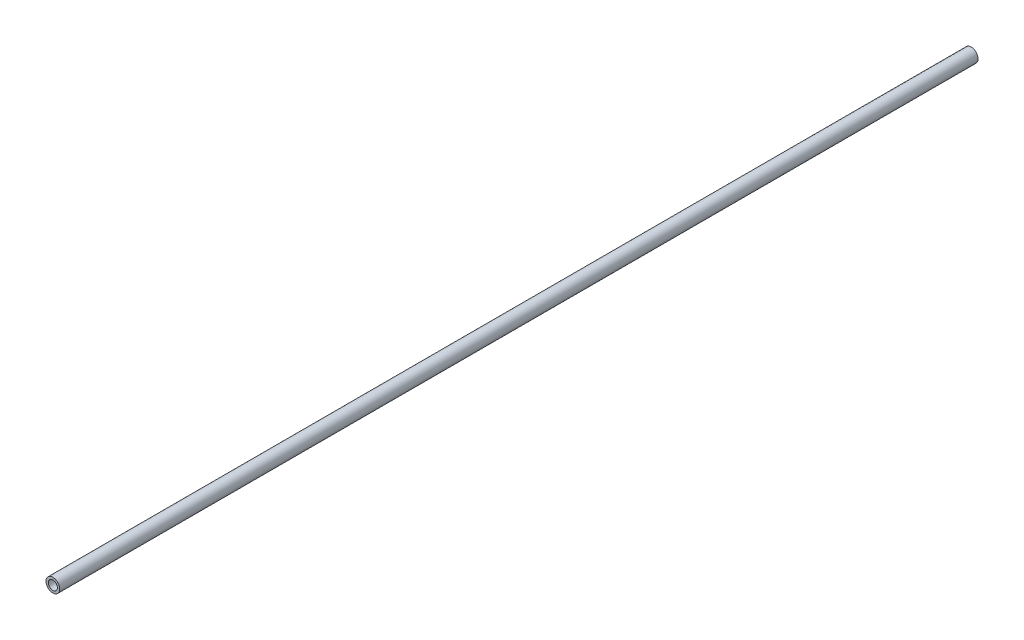
ISO-10303-21;
HEADER;
FILE_DESCRIPTION(('STEP AP214'),'2;1');
FILE_NAME('part.step','',(''),(''),'','','');
FILE_SCHEMA(('AUTOMOTIVE_DESIGN { 1 0 10303 214 1 1 1 1 }'));
ENDSEC;
DATA;
#1=APPLICATION_CONTEXT('core data for automotive mechanical design processes');
#2=APPLICATION_PROTOCOL_DEFINITION('international standard','automotive_design',2000,#1);
#3=PRODUCT_CONTEXT('',#1,'mechanical');
#4=PRODUCT('Part','Part','',(#3));
#5=PRODUCT_RELATED_PRODUCT_CATEGORY('part','',(#4));
#6=PRODUCT_DEFINITION_FORMATION('','',#4);
#7=PRODUCT_DEFINITION_CONTEXT('part definition',#1,'design');
#8=PRODUCT_DEFINITION('design','',#6,#7);
#9=PRODUCT_DEFINITION_SHAPE('','',#8);
#10=(LENGTH_UNIT() NAMED_UNIT(*) SI_UNIT(.MILLI.,.METRE.));
#11=(NAMED_UNIT(*) PLANE_ANGLE_UNIT() SI_UNIT($,.RADIAN.));
#12=(NAMED_UNIT(*) SI_UNIT($,.STERADIAN.) SOLID_ANGLE_UNIT());
#13=UNCERTAINTY_MEASURE_WITH_UNIT(LENGTH_MEASURE(1.E-05),#10,'distance_accuracy_value','');
#14=(GEOMETRIC_REPRESENTATION_CONTEXT(3) GLOBAL_UNCERTAINTY_ASSIGNED_CONTEXT((#13)) GLOBAL_UNIT_ASSIGNED_CONTEXT((#10,
#11,#12)) REPRESENTATION_CONTEXT('',''));
#15=CARTESIAN_POINT('',(0.,0.,0.));
#16=DIRECTION('',(0.,0.,1.));
#17=DIRECTION('',(1.,0.,0.));
#18=AXIS2_PLACEMENT_3D('',#15,#16,#17);
#19=CARTESIAN_POINT('',(0.,0.,1282.7));
#20=DIRECTION('',(0.,0.,1.));
#21=DIRECTION('',(1.,0.,0.));
#22=AXIS2_PLACEMENT_3D('',#19,#20,#21);
#23=PLANE('',#22);
#24=CARTESIAN_POINT('',(0.,0.,1282.7));
#25=DIRECTION('',(0.,0.,1.));
#26=DIRECTION('',(1.,0.,0.));
#27=AXIS2_PLACEMENT_3D('',#24,#25,#26);
#28=CIRCLE('',#27,9.525);
#29=CARTESIAN_POINT('',(-9.525,0.,1282.7));
#30=VERTEX_POINT('',#29);
#31=EDGE_CURVE('E10',#30,#30,#28,.T.);
#32=ORIENTED_EDGE('',*,*,#31,.T.);
#33=EDGE_LOOP('',(#32));
#34=FACE_BOUND('',#33,.T.);
#35=CARTESIAN_POINT('',(0.,0.,1282.7));
#36=DIRECTION('',(0.,0.,1.));
#37=DIRECTION('',(1.,0.,0.));
#38=AXIS2_PLACEMENT_3D('',#35,#36,#37);
#39=CIRCLE('',#38,6.35);
#40=CARTESIAN_POINT('',(-6.35,0.,1282.7));
#41=VERTEX_POINT('',#40);
#42=EDGE_CURVE('E48',#41,#41,#39,.T.);
#43=ORIENTED_EDGE('',*,*,#42,.F.);
#44=EDGE_LOOP('',(#43));
#45=FACE_BOUND('',#44,.T.);
#46=ADVANCED_FACE('F37',(#34,#45),#23,.T.);
#47=CARTESIAN_POINT('',(0.,0.,0.));
#48=DIRECTION('',(0.,0.,1.));
#49=DIRECTION('',(1.,0.,0.));
#50=AXIS2_PLACEMENT_3D('',#47,#48,#49);
#51=PLANE('',#50);
#52=CARTESIAN_POINT('',(0.,0.,0.));
#53=DIRECTION('',(0.,0.,1.));
#54=DIRECTION('',(1.,0.,0.));
#55=AXIS2_PLACEMENT_3D('',#52,#53,#54);
#56=CIRCLE('',#55,9.525);
#57=CARTESIAN_POINT('',(-9.525,0.,0.));
#58=VERTEX_POINT('',#57);
#59=EDGE_CURVE('E41',#58,#58,#56,.T.);
#60=ORIENTED_EDGE('',*,*,#59,.F.);
#61=EDGE_LOOP('',(#60));
#62=FACE_BOUND('',#61,.T.);
#63=CARTESIAN_POINT('',(0.,0.,0.));
#64=DIRECTION('',(0.,0.,1.));
#65=DIRECTION('',(1.,0.,0.));
#66=AXIS2_PLACEMENT_3D('',#63,#64,#65);
#67=CIRCLE('',#66,6.35);
#68=CARTESIAN_POINT('',(-6.35,0.,0.));
#69=VERTEX_POINT('',#68);
#70=EDGE_CURVE('E50',#69,#69,#67,.T.);
#71=ORIENTED_EDGE('',*,*,#70,.T.);
#72=EDGE_LOOP('',(#71));
#73=FACE_BOUND('',#72,.T.);
#74=ADVANCED_FACE('F60',(#62,#73),#51,.F.);
#75=CARTESIAN_POINT('',(0.,0.,1282.7));
#76=DIRECTION('',(0.,0.,-1.));
#77=DIRECTION('',(-1.,0.,0.));
#78=AXIS2_PLACEMENT_3D('',#75,#76,#77);
#79=CYLINDRICAL_SURFACE('',#78,9.525);
#80=CARTESIAN_POINT('',(-9.525,0.,1282.7));
#81=CARTESIAN_POINT('',(-9.525,0.,1269.33854166667));
#82=CARTESIAN_POINT('',(-9.525,0.,1255.97708333333));
#83=CARTESIAN_POINT('',(-9.525,0.,1229.25416666667));
#84=CARTESIAN_POINT('',(-9.525,0.,1215.89270833333));
#85=CARTESIAN_POINT('',(-9.525,0.,1189.16979166667));
#86=CARTESIAN_POINT('',(-9.525,0.,1175.80833333333));
#87=CARTESIAN_POINT('',(-9.525,0.,1149.08541666667));
#88=CARTESIAN_POINT('',(-9.525,0.,1135.72395833333));
#89=CARTESIAN_POINT('',(-9.525,0.,1109.00104166667));
#90=CARTESIAN_POINT('',(-9.525,0.,1095.63958333333));
#91=CARTESIAN_POINT('',(-9.525,0.,1068.91666666667));
#92=CARTESIAN_POINT('',(-9.525,0.,1055.55520833333));
#93=CARTESIAN_POINT('',(-9.525,0.,1028.83229166667));
#94=CARTESIAN_POINT('',(-9.525,0.,1015.47083333333));
#95=CARTESIAN_POINT('',(-9.525,0.,988.747916666666));
#96=CARTESIAN_POINT('',(-9.525,0.,975.386458333333));
#97=CARTESIAN_POINT('',(-9.525,0.,948.663541666667));
#98=CARTESIAN_POINT('',(-9.525,0.,935.302083333333));
#99=CARTESIAN_POINT('',(-9.525,0.,908.579166666667));
#100=CARTESIAN_POINT('',(-9.525,0.,895.217708333333));
#101=CARTESIAN_POINT('',(-9.525,0.,868.494791666667));
#102=CARTESIAN_POINT('',(-9.525,0.,855.133333333333));
#103=CARTESIAN_POINT('',(-9.525,0.,828.410416666666));
#104=CARTESIAN_POINT('',(-9.525,0.,815.048958333333));
#105=CARTESIAN_POINT('',(-9.525,0.,788.326041666667));
#106=CARTESIAN_POINT('',(-9.525,0.,774.964583333333));
#107=CARTESIAN_POINT('',(-9.525,0.,748.241666666667));
#108=CARTESIAN_POINT('',(-9.525,0.,734.880208333333));
#109=CARTESIAN_POINT('',(-9.525,0.,708.157291666667));
#110=CARTESIAN_POINT('',(-9.525,0.,694.795833333333));
#111=CARTESIAN_POINT('',(-9.525,0.,668.072916666667));
#112=CARTESIAN_POINT('',(-9.525,0.,654.711458333333));
#113=CARTESIAN_POINT('',(-9.525,0.,627.988541666667));
#114=CARTESIAN_POINT('',(-9.525,0.,614.627083333333));
#115=CARTESIAN_POINT('',(-9.525,0.,587.904166666667));
#116=CARTESIAN_POINT('',(-9.525,0.,574.542708333333));
#117=CARTESIAN_POINT('',(-9.525,0.,547.819791666667));
#118=CARTESIAN_POINT('',(-9.525,0.,534.458333333333));
#119=CARTESIAN_POINT('',(-9.525,0.,507.735416666667));
#120=CARTESIAN_POINT('',(-9.525,0.,494.373958333333));
#121=CARTESIAN_POINT('',(-9.525,0.,467.651041666667));
#122=CARTESIAN_POINT('',(-9.525,0.,454.289583333333));
#123=CARTESIAN_POINT('',(-9.525,0.,427.566666666667));
#124=CARTESIAN_POINT('',(-9.525,0.,414.205208333333));
#125=CARTESIAN_POINT('',(-9.525,0.,387.482291666667));
#126=CARTESIAN_POINT('',(-9.525,0.,374.120833333333));
#127=CARTESIAN_POINT('',(-9.525,0.,347.397916666667));
#128=CARTESIAN_POINT('',(-9.525,0.,334.036458333333));
#129=CARTESIAN_POINT('',(-9.525,0.,307.313541666667));
#130=CARTESIAN_POINT('',(-9.525,0.,293.952083333333));
#131=CARTESIAN_POINT('',(-9.525,0.,267.229166666667));
#132=CARTESIAN_POINT('',(-9.525,0.,253.867708333333));
#133=CARTESIAN_POINT('',(-9.525,0.,227.144791666667));
#134=CARTESIAN_POINT('',(-9.525,0.,213.783333333333));
#135=CARTESIAN_POINT('',(-9.525,0.,187.060416666667));
#136=CARTESIAN_POINT('',(-9.525,0.,173.698958333333));
#137=CARTESIAN_POINT('',(-9.525,0.,146.976041666667));
#138=CARTESIAN_POINT('',(-9.525,0.,133.614583333333));
#139=CARTESIAN_POINT('',(-9.525,0.,106.891666666667));
#140=CARTESIAN_POINT('',(-9.525,0.,93.5302083333333));
#141=CARTESIAN_POINT('',(-9.525,0.,66.8072916666666));
#142=CARTESIAN_POINT('',(-9.525,0.,53.4458333333333));
#143=CARTESIAN_POINT('',(-9.525,0.,26.7229166666666));
#144=CARTESIAN_POINT('',(-9.525,0.,13.3614583333333));
#145=CARTESIAN_POINT('',(-9.525,0.,0.));
#146=B_SPLINE_CURVE_WITH_KNOTS('',3,(#80,#81,#82,#83,#84,#85,#86,#87,#88,#89,#90,#91,#92,#93,
#94,#95,#96,#97,#98,#99,#100,#101,#102,#103,#104,#105,#106,#107,#108,#109,#110,#111,#112,#113,
#114,#115,#116,#117,#118,#119,#120,#121,#122,#123,#124,#125,#126,#127,#128,#129,#130,#131,#132,
#133,#134,#135,#136,#137,#138,#139,#140,#141,#142,#143,#144,#145),.UNSPECIFIED.,.F.,.F.,(4,2,2,
2,2,2,2,2,2,2,2,2,2,2,2,2,2,2,2,2,2,2,2,2,2,2,2,2,2,2,2,2,4),(0.,40.084375,80.1687499999999,
120.253125,160.3375,200.421875,240.50625,280.590625,320.675,360.759375,400.84375,440.928125,
481.0125,521.096875,561.18125,601.265625,641.35,681.434375,721.51875,761.603125,801.6875,
841.771875,881.85625,921.940625,962.025,1002.109375,1042.19375,1082.278125,1122.3625,
1162.446875,1202.53125,1242.615625,1282.7),.UNSPECIFIED.);
#147=EDGE_CURVE('BSEAM39',#30,#58,#146,.T.);
#148=ORIENTED_EDGE('',*,*,#31,.F.);
#149=ORIENTED_EDGE('',*,*,#59,.T.);
#150=ORIENTED_EDGE('',*,*,#147,.T.);
#151=ORIENTED_EDGE('',*,*,#147,.F.);
#152=EDGE_LOOP('',(#148,#150,#149,#151));
#153=FACE_BOUND('',#152,.T.);
#154=ADVANCED_FACE('F39',(#153),#79,.T.);
#155=CARTESIAN_POINT('',(0.,0.,1282.7));
#156=DIRECTION('',(0.,0.,-1.));
#157=DIRECTION('',(-1.,0.,0.));
#158=AXIS2_PLACEMENT_3D('',#155,#156,#157);
#159=CYLINDRICAL_SURFACE('',#158,6.35);
#160=CARTESIAN_POINT('',(-6.35,0.,1282.7));
#161=CARTESIAN_POINT('',(-6.35,0.,1269.33854166667));
#162=CARTESIAN_POINT('',(-6.35,0.,1255.97708333333));
#163=CARTESIAN_POINT('',(-6.35,0.,1229.25416666667));
#164=CARTESIAN_POINT('',(-6.35,0.,1215.89270833333));
#165=CARTESIAN_POINT('',(-6.35,0.,1189.16979166667));
#166=CARTESIAN_POINT('',(-6.35,0.,1175.80833333333));
#167=CARTESIAN_POINT('',(-6.35,0.,1149.08541666667));
#168=CARTESIAN_POINT('',(-6.35,0.,1135.72395833333));
#169=CARTESIAN_POINT('',(-6.35,0.,1109.00104166667));
#170=CARTESIAN_POINT('',(-6.35,0.,1095.63958333333));
#171=CARTESIAN_POINT('',(-6.35,0.,1068.91666666667));
#172=CARTESIAN_POINT('',(-6.35,0.,1055.55520833333));
#173=CARTESIAN_POINT('',(-6.35,0.,1028.83229166667));
#174=CARTESIAN_POINT('',(-6.35,0.,1015.47083333333));
#175=CARTESIAN_POINT('',(-6.35,0.,988.747916666666));
#176=CARTESIAN_POINT('',(-6.35,0.,975.386458333333));
#177=CARTESIAN_POINT('',(-6.35,0.,948.663541666667));
#178=CARTESIAN_POINT('',(-6.35,0.,935.302083333333));
#179=CARTESIAN_POINT('',(-6.35,0.,908.579166666667));
#180=CARTESIAN_POINT('',(-6.35,0.,895.217708333333));
#181=CARTESIAN_POINT('',(-6.35,0.,868.494791666667));
#182=CARTESIAN_POINT('',(-6.35,0.,855.133333333333));
#183=CARTESIAN_POINT('',(-6.35,0.,828.410416666666));
#184=CARTESIAN_POINT('',(-6.35,0.,815.048958333333));
#185=CARTESIAN_POINT('',(-6.35,0.,788.326041666667));
#186=CARTESIAN_POINT('',(-6.35,0.,774.964583333333));
#187=CARTESIAN_POINT('',(-6.35,0.,748.241666666667));
#188=CARTESIAN_POINT('',(-6.35,0.,734.880208333333));
#189=CARTESIAN_POINT('',(-6.35,0.,708.157291666667));
#190=CARTESIAN_POINT('',(-6.35,0.,694.795833333333));
#191=CARTESIAN_POINT('',(-6.35,0.,668.072916666667));
#192=CARTESIAN_POINT('',(-6.35,0.,654.711458333333));
#193=CARTESIAN_POINT('',(-6.35,0.,627.988541666667));
#194=CARTESIAN_POINT('',(-6.35,0.,614.627083333333));
#195=CARTESIAN_POINT('',(-6.35,0.,587.904166666667));
#196=CARTESIAN_POINT('',(-6.35,0.,574.542708333333));
#197=CARTESIAN_POINT('',(-6.35,0.,547.819791666667));
#198=CARTESIAN_POINT('',(-6.35,0.,534.458333333333));
#199=CARTESIAN_POINT('',(-6.35,0.,507.735416666667));
#200=CARTESIAN_POINT('',(-6.35,0.,494.373958333333));
#201=CARTESIAN_POINT('',(-6.35,0.,467.651041666667));
#202=CARTESIAN_POINT('',(-6.35,0.,454.289583333333));
#203=CARTESIAN_POINT('',(-6.35,0.,427.566666666667));
#204=CARTESIAN_POINT('',(-6.35,0.,414.205208333333));
#205=CARTESIAN_POINT('',(-6.35,0.,387.482291666667));
#206=CARTESIAN_POINT('',(-6.35,0.,374.120833333333));
#207=CARTESIAN_POINT('',(-6.35,0.,347.397916666667));
#208=CARTESIAN_POINT('',(-6.35,0.,334.036458333333));
#209=CARTESIAN_POINT('',(-6.35,0.,307.313541666667));
#210=CARTESIAN_POINT('',(-6.35,0.,293.952083333333));
#211=CARTESIAN_POINT('',(-6.35,0.,267.229166666667));
#212=CARTESIAN_POINT('',(-6.35,0.,253.867708333333));
#213=CARTESIAN_POINT('',(-6.35,0.,227.144791666667));
#214=CARTESIAN_POINT('',(-6.35,0.,213.783333333333));
#215=CARTESIAN_POINT('',(-6.35,0.,187.060416666667));
#216=CARTESIAN_POINT('',(-6.35,0.,173.698958333333));
#217=CARTESIAN_POINT('',(-6.35,0.,146.976041666667));
#218=CARTESIAN_POINT('',(-6.35,0.,133.614583333333));
#219=CARTESIAN_POINT('',(-6.35,0.,106.891666666667));
#220=CARTESIAN_POINT('',(-6.35,0.,93.5302083333333));
#221=CARTESIAN_POINT('',(-6.35,0.,66.8072916666666));
#222=CARTESIAN_POINT('',(-6.35,0.,53.4458333333333));
#223=CARTESIAN_POINT('',(-6.35,0.,26.7229166666666));
#224=CARTESIAN_POINT('',(-6.35,0.,13.3614583333333));
#225=CARTESIAN_POINT('',(-6.35,0.,0.));
#226=B_SPLINE_CURVE_WITH_KNOTS('',3,(#160,#161,#162,#163,#164,#165,#166,#167,#168,#169,#170,
#171,#172,#173,#174,#175,#176,#177,#178,#179,#180,#181,#182,#183,#184,#185,#186,#187,#188,#189,
#190,#191,#192,#193,#194,#195,#196,#197,#198,#199,#200,#201,#202,#203,#204,#205,#206,#207,#208,
#209,#210,#211,#212,#213,#214,#215,#216,#217,#218,#219,#220,#221,#222,#223,#224,#225),
.UNSPECIFIED.,.F.,.F.,(4,2,2,2,2,2,2,2,2,2,2,2,2,2,2,2,2,2,2,2,2,2,2,2,2,2,2,2,2,2,2,2,4),(0.,
40.084375,80.1687499999999,120.253125,160.3375,200.421875,240.50625,280.590625,320.675,
360.759375,400.84375,440.928125,481.0125,521.096875,561.18125,601.265625,641.35,681.434375,
721.51875,761.603125,801.6875,841.771875,881.85625,921.940625,962.025,1002.109375,1042.19375,
1082.278125,1122.3625,1162.446875,1202.53125,1242.615625,1282.7),.UNSPECIFIED.);
#227=EDGE_CURVE('BSEAM56',#41,#69,#226,.T.);
#228=ORIENTED_EDGE('',*,*,#42,.T.);
#229=ORIENTED_EDGE('',*,*,#70,.F.);
#230=ORIENTED_EDGE('',*,*,#227,.T.);
#231=ORIENTED_EDGE('',*,*,#227,.F.);
#232=EDGE_LOOP('',(#228,#230,#229,#231));
#233=FACE_BOUND('',#232,.T.);
#234=ADVANCED_FACE('F56',(#233),#159,.F.);
#235=CLOSED_SHELL('',(#46,#74,#154,#234));
#236=MANIFOLD_SOLID_BREP('B2',#235);
#237=ADVANCED_BREP_SHAPE_REPRESENTATION('',(#18,#236),#14);
#238=SHAPE_DEFINITION_REPRESENTATION(#9,#237);
ENDSEC;
END-ISO-10303-21;
